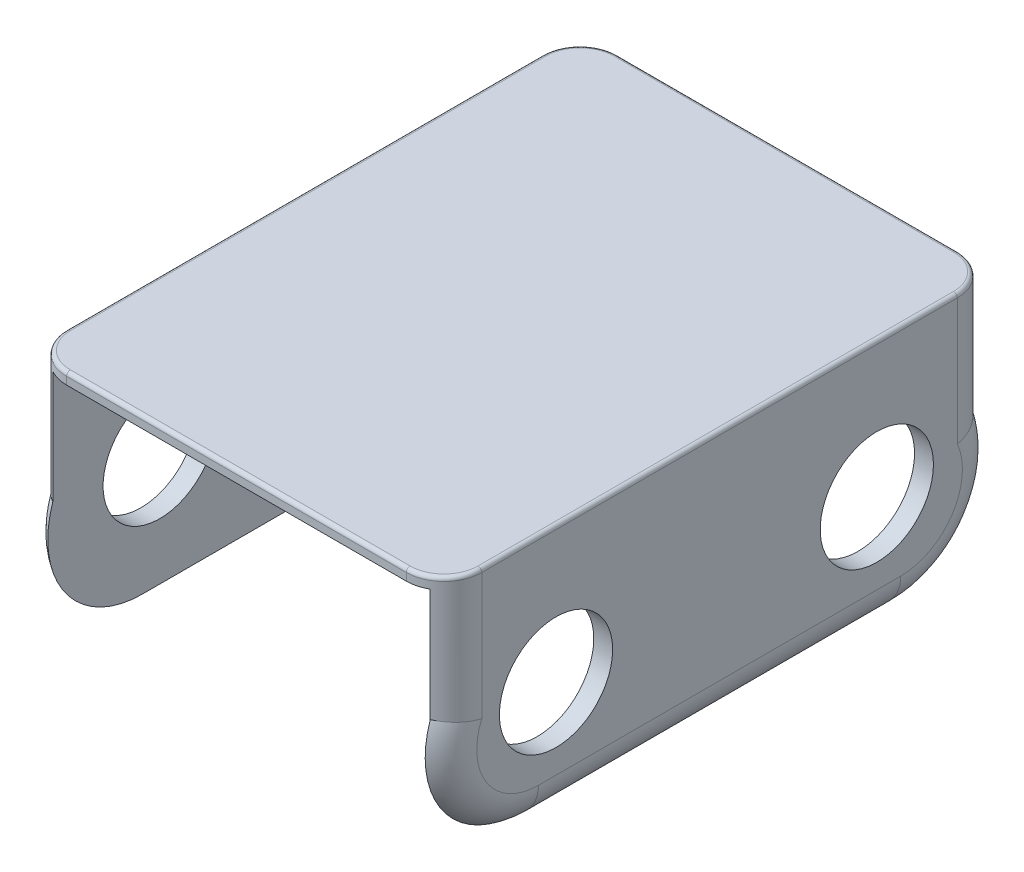
ISO-10303-21;
HEADER;
FILE_DESCRIPTION(('STEP AP214'),'2;1');
FILE_NAME('part.step','',(''),(''),'','','');
FILE_SCHEMA(('AUTOMOTIVE_DESIGN { 1 0 10303 214 1 1 1 1 }'));
ENDSEC;
DATA;
#1=APPLICATION_CONTEXT('core data for automotive mechanical design processes');
#2=APPLICATION_PROTOCOL_DEFINITION('international standard','automotive_design',2000,#1);
#3=PRODUCT_CONTEXT('',#1,'mechanical');
#4=PRODUCT('Part','Part','',(#3));
#5=PRODUCT_RELATED_PRODUCT_CATEGORY('part','',(#4));
#6=PRODUCT_DEFINITION_FORMATION('','',#4);
#7=PRODUCT_DEFINITION_CONTEXT('part definition',#1,'design');
#8=PRODUCT_DEFINITION('design','',#6,#7);
#9=PRODUCT_DEFINITION_SHAPE('','',#8);
#10=(LENGTH_UNIT() NAMED_UNIT(*) SI_UNIT(.MILLI.,.METRE.));
#11=(NAMED_UNIT(*) PLANE_ANGLE_UNIT() SI_UNIT($,.RADIAN.));
#12=(NAMED_UNIT(*) SI_UNIT($,.STERADIAN.) SOLID_ANGLE_UNIT());
#13=UNCERTAINTY_MEASURE_WITH_UNIT(LENGTH_MEASURE(1.E-05),#10,'distance_accuracy_value','');
#14=(GEOMETRIC_REPRESENTATION_CONTEXT(3) GLOBAL_UNCERTAINTY_ASSIGNED_CONTEXT((#13)) GLOBAL_UNIT_ASSIGNED_CONTEXT((#10,
#11,#12)) REPRESENTATION_CONTEXT('',''));
#15=CARTESIAN_POINT('',(0.,0.,0.));
#16=DIRECTION('',(0.,0.,1.));
#17=DIRECTION('',(1.,0.,0.));
#18=AXIS2_PLACEMENT_3D('',#15,#16,#17);
#19=CARTESIAN_POINT('',(0.,13.,0.));
#20=DIRECTION('',(0.,1.,0.));
#21=DIRECTION('',(0.,0.,1.));
#22=AXIS2_PLACEMENT_3D('',#19,#20,#21);
#23=PLANE('',#22);
#24=DIRECTION('',(0.,0.,1.));
#25=VECTOR('',#24,1.);
#26=CARTESIAN_POINT('',(-10.,13.,-15.));
#27=LINE('',#26,#25);
#28=CARTESIAN_POINT('',(-10.,13.,-14.3320508075689));
#29=VERTEX_POINT('',#28);
#30=CARTESIAN_POINT('',(-10.,13.,14.332050807569));
#31=VERTEX_POINT('',#30);
#32=EDGE_CURVE('E205',#29,#31,#27,.T.);
#33=ORIENTED_EDGE('',*,*,#32,.F.);
#34=CARTESIAN_POINT('',(-9.,13.,-12.6));
#35=DIRECTION('',(0.,1.,0.));
#36=DIRECTION('',(0.,0.,1.));
#37=AXIS2_PLACEMENT_3D('',#34,#35,#36);
#38=CIRCLE('',#37,2.);
#39=CARTESIAN_POINT('',(-9.,13.,-14.6));
#40=VERTEX_POINT('',#39);
#41=EDGE_CURVE('E241',#29,#40,#38,.F.);
#42=ORIENTED_EDGE('',*,*,#41,.T.);
#43=DIRECTION('',(-1.,0.,0.));
#44=VECTOR('',#43,1.);
#45=CARTESIAN_POINT('',(0.,13.,-14.6));
#46=LINE('',#45,#44);
#47=CARTESIAN_POINT('',(9.,13.,-14.6));
#48=VERTEX_POINT('',#47);
#49=EDGE_CURVE('E211',#48,#40,#46,.T.);
#50=ORIENTED_EDGE('',*,*,#49,.F.);
#51=CARTESIAN_POINT('',(9.,13.,-12.6));
#52=DIRECTION('',(0.,1.,0.));
#53=DIRECTION('',(0.,0.,1.));
#54=AXIS2_PLACEMENT_3D('',#51,#52,#53);
#55=CIRCLE('',#54,2.);
#56=CARTESIAN_POINT('',(10.,13.,-14.332050807569));
#57=VERTEX_POINT('',#56);
#58=EDGE_CURVE('E235',#48,#57,#55,.F.);
#59=ORIENTED_EDGE('',*,*,#58,.T.);
#60=DIRECTION('',(0.,0.,-1.));
#61=VECTOR('',#60,1.);
#62=CARTESIAN_POINT('',(10.,13.,-15.));
#63=LINE('',#62,#61);
#64=CARTESIAN_POINT('',(10.,13.,14.3320508075689));
#65=VERTEX_POINT('',#64);
#66=EDGE_CURVE('E200',#65,#57,#63,.T.);
#67=ORIENTED_EDGE('',*,*,#66,.F.);
#68=CARTESIAN_POINT('',(9.,13.,12.6));
#69=DIRECTION('',(0.,1.,0.));
#70=DIRECTION('',(0.,0.,1.));
#71=AXIS2_PLACEMENT_3D('',#68,#69,#70);
#72=CIRCLE('',#71,2.);
#73=CARTESIAN_POINT('',(9.,13.,14.6));
#74=VERTEX_POINT('',#73);
#75=EDGE_CURVE('E239',#65,#74,#72,.F.);
#76=ORIENTED_EDGE('',*,*,#75,.T.);
#77=DIRECTION('',(1.,0.,0.));
#78=VECTOR('',#77,1.);
#79=CARTESIAN_POINT('',(0.,13.,14.6));
#80=LINE('',#79,#78);
#81=CARTESIAN_POINT('',(-9.,13.,14.6));
#82=VERTEX_POINT('',#81);
#83=EDGE_CURVE('E208',#82,#74,#80,.T.);
#84=ORIENTED_EDGE('',*,*,#83,.F.);
#85=CARTESIAN_POINT('',(-9.,13.,12.6));
#86=DIRECTION('',(0.,1.,0.));
#87=DIRECTION('',(0.,0.,1.));
#88=AXIS2_PLACEMENT_3D('',#85,#86,#87);
#89=CIRCLE('',#88,2.);
#90=EDGE_CURVE('E237',#82,#31,#89,.F.);
#91=ORIENTED_EDGE('',*,*,#90,.T.);
#92=EDGE_LOOP('',(#33,#42,#50,#59,#67,#76,#84,#91));
#93=FACE_BOUND('',#92,.T.);
#94=ADVANCED_FACE('F34',(#93),#23,.F.);
#95=CARTESIAN_POINT('',(-10.,14.,-15.));
#96=DIRECTION('',(1.,0.,0.));
#97=DIRECTION('',(0.,0.,-1.));
#98=AXIS2_PLACEMENT_3D('',#95,#96,#97);
#99=PLANE('',#98);
#100=CARTESIAN_POINT('',(-10.,6.4,8.66794919243085));
#101=DIRECTION('',(1.,0.,0.));
#102=DIRECTION('',(0.,0.,-1.));
#103=AXIS2_PLACEMENT_3D('',#100,#101,#102);
#104=CIRCLE('',#103,3.);
#105=CARTESIAN_POINT('',(-10.,6.4,5.66794919243085));
#106=VERTEX_POINT('',#105);
#107=EDGE_CURVE('E486',#106,#106,#104,.T.);
#108=ORIENTED_EDGE('',*,*,#107,.F.);
#109=EDGE_LOOP('',(#108));
#110=FACE_BOUND('',#109,.T.);
#111=CARTESIAN_POINT('',(-10.,6.4,-8.33205080756915));
#112=DIRECTION('',(1.,0.,0.));
#113=DIRECTION('',(0.,0.,-1.));
#114=AXIS2_PLACEMENT_3D('',#111,#112,#113);
#115=CIRCLE('',#114,3.);
#116=CARTESIAN_POINT('',(-10.,6.4,-11.3320508075691));
#117=VERTEX_POINT('',#116);
#118=EDGE_CURVE('E363',#117,#117,#115,.T.);
#119=ORIENTED_EDGE('',*,*,#118,.F.);
#120=EDGE_LOOP('',(#119));
#121=FACE_BOUND('',#120,.T.);
#122=CARTESIAN_POINT('',(-10.,5.4,-9.6));
#123=DIRECTION('',(1.,0.,0.));
#124=DIRECTION('',(0.,0.,-1.));
#125=AXIS2_PLACEMENT_3D('',#122,#123,#124);
#126=CIRCLE('',#125,5.);
#127=CARTESIAN_POINT('',(-10.,0.4,-9.59999999999996));
#128=VERTEX_POINT('',#127);
#129=CARTESIAN_POINT('',(-10.,7.01483595284064,-14.3320508075689));
#130=VERTEX_POINT('',#129);
#131=EDGE_CURVE('E218',#128,#130,#126,.T.);
#132=ORIENTED_EDGE('',*,*,#131,.T.);
#133=DIRECTION('',(0.,1.,0.));
#134=VECTOR('',#133,1.);
#135=CARTESIAN_POINT('',(-10.,7.01483595284064,-14.3320508075689));
#136=LINE('',#135,#134);
#137=EDGE_CURVE('E233',#130,#29,#136,.T.);
#138=ORIENTED_EDGE('',*,*,#137,.T.);
#139=ORIENTED_EDGE('',*,*,#32,.T.);
#140=DIRECTION('',(0.,-1.,0.));
#141=VECTOR('',#140,1.);
#142=CARTESIAN_POINT('',(-10.,13.,14.3320508075689));
#143=LINE('',#142,#141);
#144=CARTESIAN_POINT('',(-10.,7.01483595283983,14.3320508075692));
#145=VERTEX_POINT('',#144);
#146=EDGE_CURVE('E230',#31,#145,#143,.T.);
#147=ORIENTED_EDGE('',*,*,#146,.T.);
#148=CARTESIAN_POINT('',(-10.,5.4,9.6));
#149=DIRECTION('',(1.,0.,0.));
#150=DIRECTION('',(0.,0.,-1.));
#151=AXIS2_PLACEMENT_3D('',#148,#149,#150);
#152=CIRCLE('',#151,5.);
#153=CARTESIAN_POINT('',(-10.,0.4,9.59999999999997));
#154=VERTEX_POINT('',#153);
#155=EDGE_CURVE('E214',#145,#154,#152,.T.);
#156=ORIENTED_EDGE('',*,*,#155,.T.);
#157=DIRECTION('',(0.,0.,-1.));
#158=VECTOR('',#157,1.);
#159=CARTESIAN_POINT('',(-10.,0.399999999999999,-15.));
#160=LINE('',#159,#158);
#161=EDGE_CURVE('E216',#154,#128,#160,.T.);
#162=ORIENTED_EDGE('',*,*,#161,.T.);
#163=EDGE_LOOP('',(#132,#138,#139,#147,#156,#162));
#164=FACE_BOUND('',#163,.T.);
#165=ADVANCED_FACE('F445',(#110,#121,#164),#99,.T.);
#166=CARTESIAN_POINT('',(10.,14.,-15.));
#167=DIRECTION('',(-1.,0.,0.));
#168=DIRECTION('',(0.,0.,1.));
#169=AXIS2_PLACEMENT_3D('',#166,#167,#168);
#170=PLANE('',#169);
#171=CARTESIAN_POINT('',(10.,6.4,8.66794919243085));
#172=DIRECTION('',(-1.,0.,0.));
#173=DIRECTION('',(0.,0.,1.));
#174=AXIS2_PLACEMENT_3D('',#171,#172,#173);
#175=CIRCLE('',#174,3.);
#176=CARTESIAN_POINT('',(10.,6.4,11.6679491924308));
#177=VERTEX_POINT('',#176);
#178=EDGE_CURVE('E492',#177,#177,#175,.T.);
#179=ORIENTED_EDGE('',*,*,#178,.F.);
#180=EDGE_LOOP('',(#179));
#181=FACE_BOUND('',#180,.T.);
#182=CARTESIAN_POINT('',(10.,6.4,-8.33205080756915));
#183=DIRECTION('',(-1.,0.,0.));
#184=DIRECTION('',(0.,0.,1.));
#185=AXIS2_PLACEMENT_3D('',#182,#183,#184);
#186=CIRCLE('',#185,3.);
#187=CARTESIAN_POINT('',(10.,6.4,-5.33205080756915));
#188=VERTEX_POINT('',#187);
#189=EDGE_CURVE('E489',#188,#188,#186,.T.);
#190=ORIENTED_EDGE('',*,*,#189,.F.);
#191=EDGE_LOOP('',(#190));
#192=FACE_BOUND('',#191,.T.);
#193=CARTESIAN_POINT('',(10.,5.4,9.6));
#194=DIRECTION('',(-1.,0.,0.));
#195=DIRECTION('',(0.,0.,1.));
#196=AXIS2_PLACEMENT_3D('',#193,#194,#195);
#197=CIRCLE('',#196,5.);
#198=CARTESIAN_POINT('',(10.,0.4,9.59999999999997));
#199=VERTEX_POINT('',#198);
#200=CARTESIAN_POINT('',(10.,7.01483595284064,14.3320508075689));
#201=VERTEX_POINT('',#200);
#202=EDGE_CURVE('E198',#199,#201,#197,.T.);
#203=ORIENTED_EDGE('',*,*,#202,.T.);
#204=DIRECTION('',(0.,-1.,0.));
#205=VECTOR('',#204,1.);
#206=CARTESIAN_POINT('',(10.,7.01483595284064,14.3320508075689));
#207=LINE('',#206,#205);
#208=EDGE_CURVE('E263',#201,#65,#207,.F.);
#209=ORIENTED_EDGE('',*,*,#208,.T.);
#210=ORIENTED_EDGE('',*,*,#66,.T.);
#211=DIRECTION('',(0.,1.,0.));
#212=VECTOR('',#211,1.);
#213=CARTESIAN_POINT('',(10.,13.,-14.3320508075689));
#214=LINE('',#213,#212);
#215=CARTESIAN_POINT('',(10.,7.01483595283983,-14.3320508075692));
#216=VERTEX_POINT('',#215);
#217=EDGE_CURVE('E179',#57,#216,#214,.F.);
#218=ORIENTED_EDGE('',*,*,#217,.T.);
#219=CARTESIAN_POINT('',(10.,5.4,-9.6));
#220=DIRECTION('',(-1.,0.,0.));
#221=DIRECTION('',(0.,0.,1.));
#222=AXIS2_PLACEMENT_3D('',#219,#220,#221);
#223=CIRCLE('',#222,5.);
#224=CARTESIAN_POINT('',(10.,0.4,-9.59999999999996));
#225=VERTEX_POINT('',#224);
#226=EDGE_CURVE('E171',#216,#225,#223,.T.);
#227=ORIENTED_EDGE('',*,*,#226,.T.);
#228=DIRECTION('',(0.,0.,1.));
#229=VECTOR('',#228,1.);
#230=CARTESIAN_POINT('',(10.,0.399999999999999,-15.));
#231=LINE('',#230,#229);
#232=EDGE_CURVE('E175',#225,#199,#231,.T.);
#233=ORIENTED_EDGE('',*,*,#232,.T.);
#234=EDGE_LOOP('',(#203,#209,#210,#218,#227,#233));
#235=FACE_BOUND('',#234,.T.);
#236=ADVANCED_FACE('F173',(#181,#192,#235),#170,.T.);
#237=CARTESIAN_POINT('',(11.,13.6,-14.6));
#238=DIRECTION('',(0.,0.,-1.));
#239=DIRECTION('',(-1.,0.,0.));
#240=AXIS2_PLACEMENT_3D('',#237,#238,#239);
#241=PLANE('',#240);
#242=DIRECTION('',(0.,-1.,0.));
#243=VECTOR('',#242,1.);
#244=CARTESIAN_POINT('',(-9.,13.6,-14.6));
#245=LINE('',#244,#243);
#246=CARTESIAN_POINT('',(-9.,13.4,-14.6));
#247=VERTEX_POINT('',#246);
#248=EDGE_CURVE('E245',#40,#247,#245,.F.);
#249=ORIENTED_EDGE('',*,*,#248,.T.);
#250=DIRECTION('',(-1.,0.,0.));
#251=VECTOR('',#250,1.);
#252=CARTESIAN_POINT('',(11.,13.4,-14.6));
#253=LINE('',#252,#251);
#254=CARTESIAN_POINT('',(9.,13.4,-14.6));
#255=VERTEX_POINT('',#254);
#256=EDGE_CURVE('E357',#247,#255,#253,.F.);
#257=ORIENTED_EDGE('',*,*,#256,.T.);
#258=DIRECTION('',(0.,-1.,0.));
#259=VECTOR('',#258,1.);
#260=CARTESIAN_POINT('',(9.,5.4,-14.6));
#261=LINE('',#260,#259);
#262=EDGE_CURVE('E243',#255,#48,#261,.T.);
#263=ORIENTED_EDGE('',*,*,#262,.T.);
#264=ORIENTED_EDGE('',*,*,#49,.T.);
#265=EDGE_LOOP('',(#249,#257,#263,#264));
#266=FACE_BOUND('',#265,.T.);
#267=ADVANCED_FACE('F449',(#266),#241,.T.);
#268=CARTESIAN_POINT('',(11.,13.6,14.6));
#269=DIRECTION('',(0.,1.,0.));
#270=DIRECTION('',(0.,0.,1.));
#271=AXIS2_PLACEMENT_3D('',#268,#269,#270);
#272=PLANE('',#271);
#273=DIRECTION('',(0.,0.,-1.));
#274=VECTOR('',#273,1.);
#275=CARTESIAN_POINT('',(-10.8,13.6,12.6));
#276=LINE('',#275,#274);
#277=CARTESIAN_POINT('',(-10.8,13.6,-12.6));
#278=VERTEX_POINT('',#277);
#279=CARTESIAN_POINT('',(-10.8,13.6,12.6));
#280=VERTEX_POINT('',#279);
#281=EDGE_CURVE('E265',#278,#280,#276,.F.);
#282=ORIENTED_EDGE('',*,*,#281,.T.);
#283=CARTESIAN_POINT('',(-9.,13.6,12.6));
#284=DIRECTION('',(0.,1.,0.));
#285=DIRECTION('',(0.,0.,1.));
#286=AXIS2_PLACEMENT_3D('',#283,#284,#285);
#287=CIRCLE('',#286,1.8);
#288=CARTESIAN_POINT('',(-9.,13.6,14.4));
#289=VERTEX_POINT('',#288);
#290=EDGE_CURVE('E343',#280,#289,#287,.T.);
#291=ORIENTED_EDGE('',*,*,#290,.T.);
#292=DIRECTION('',(-1.,0.,0.));
#293=VECTOR('',#292,1.);
#294=CARTESIAN_POINT('',(11.,13.6,14.4));
#295=LINE('',#294,#293);
#296=CARTESIAN_POINT('',(9.,13.6,14.4));
#297=VERTEX_POINT('',#296);
#298=EDGE_CURVE('E341',#289,#297,#295,.F.);
#299=ORIENTED_EDGE('',*,*,#298,.T.);
#300=CARTESIAN_POINT('',(9.,13.6,12.6));
#301=DIRECTION('',(0.,1.,0.));
#302=DIRECTION('',(0.,0.,1.));
#303=AXIS2_PLACEMENT_3D('',#300,#301,#302);
#304=CIRCLE('',#303,1.8);
#305=CARTESIAN_POINT('',(10.8,13.6,12.6));
#306=VERTEX_POINT('',#305);
#307=EDGE_CURVE('E339',#297,#306,#304,.T.);
#308=ORIENTED_EDGE('',*,*,#307,.T.);
#309=DIRECTION('',(0.,0.,-1.));
#310=VECTOR('',#309,1.);
#311=CARTESIAN_POINT('',(10.8,13.6,-12.6));
#312=LINE('',#311,#310);
#313=CARTESIAN_POINT('',(10.8,13.6,-12.6));
#314=VERTEX_POINT('',#313);
#315=EDGE_CURVE('E337',#306,#314,#312,.T.);
#316=ORIENTED_EDGE('',*,*,#315,.T.);
#317=CARTESIAN_POINT('',(9.,13.6,-12.6));
#318=DIRECTION('',(0.,1.,0.));
#319=DIRECTION('',(0.,0.,1.));
#320=AXIS2_PLACEMENT_3D('',#317,#318,#319);
#321=CIRCLE('',#320,1.8);
#322=CARTESIAN_POINT('',(9.,13.6,-14.4));
#323=VERTEX_POINT('',#322);
#324=EDGE_CURVE('E335',#314,#323,#321,.T.);
#325=ORIENTED_EDGE('',*,*,#324,.T.);
#326=DIRECTION('',(-1.,0.,0.));
#327=VECTOR('',#326,1.);
#328=CARTESIAN_POINT('',(11.,13.6,-14.4));
#329=LINE('',#328,#327);
#330=CARTESIAN_POINT('',(-9.,13.6,-14.4));
#331=VERTEX_POINT('',#330);
#332=EDGE_CURVE('E333',#323,#331,#329,.T.);
#333=ORIENTED_EDGE('',*,*,#332,.T.);
#334=CARTESIAN_POINT('',(-9.,13.6,-12.6));
#335=DIRECTION('',(0.,1.,0.));
#336=DIRECTION('',(0.,0.,1.));
#337=AXIS2_PLACEMENT_3D('',#334,#335,#336);
#338=CIRCLE('',#337,1.8);
#339=EDGE_CURVE('E331',#331,#278,#338,.T.);
#340=ORIENTED_EDGE('',*,*,#339,.T.);
#341=EDGE_LOOP('',(#282,#291,#299,#308,#316,#325,#333,#340));
#342=FACE_BOUND('',#341,.T.);
#343=ADVANCED_FACE('F451',(#342),#272,.T.);
#344=CARTESIAN_POINT('',(11.,5.40000000000004,14.6));
#345=DIRECTION('',(0.,0.,1.));
#346=DIRECTION('',(1.,0.,0.));
#347=AXIS2_PLACEMENT_3D('',#344,#345,#346);
#348=PLANE('',#347);
#349=DIRECTION('',(0.,1.,0.));
#350=VECTOR('',#349,1.);
#351=CARTESIAN_POINT('',(9.,13.6,14.6));
#352=LINE('',#351,#350);
#353=CARTESIAN_POINT('',(9.,13.4,14.6));
#354=VERTEX_POINT('',#353);
#355=EDGE_CURVE('E249',#74,#354,#352,.T.);
#356=ORIENTED_EDGE('',*,*,#355,.T.);
#357=DIRECTION('',(-1.,0.,0.));
#358=VECTOR('',#357,1.);
#359=CARTESIAN_POINT('',(11.,13.4,14.6));
#360=LINE('',#359,#358);
#361=CARTESIAN_POINT('',(-9.,13.4,14.6));
#362=VERTEX_POINT('',#361);
#363=EDGE_CURVE('E349',#354,#362,#360,.T.);
#364=ORIENTED_EDGE('',*,*,#363,.T.);
#365=DIRECTION('',(0.,1.,0.));
#366=VECTOR('',#365,1.);
#367=CARTESIAN_POINT('',(-9.,5.40000000000003,14.6));
#368=LINE('',#367,#366);
#369=EDGE_CURVE('E247',#362,#82,#368,.F.);
#370=ORIENTED_EDGE('',*,*,#369,.T.);
#371=ORIENTED_EDGE('',*,*,#83,.T.);
#372=EDGE_LOOP('',(#356,#364,#370,#371));
#373=FACE_BOUND('',#372,.T.);
#374=ADVANCED_FACE('F413',(#373),#348,.T.);
#375=CARTESIAN_POINT('',(-11.,14.,-15.));
#376=DIRECTION('',(1.,0.,0.));
#377=DIRECTION('',(0.,0.,-1.));
#378=AXIS2_PLACEMENT_3D('',#375,#376,#377);
#379=PLANE('',#378);
#380=CARTESIAN_POINT('',(-11.,6.4,8.66794919243085));
#381=DIRECTION('',(1.,0.,0.));
#382=DIRECTION('',(0.,0.,-1.));
#383=AXIS2_PLACEMENT_3D('',#380,#381,#382);
#384=CIRCLE('',#383,3.);
#385=CARTESIAN_POINT('',(-11.,6.4,5.66794919243085));
#386=VERTEX_POINT('',#385);
#387=EDGE_CURVE('E717',#386,#386,#384,.T.);
#388=ORIENTED_EDGE('',*,*,#387,.T.);
#389=EDGE_LOOP('',(#388));
#390=FACE_BOUND('',#389,.T.);
#391=CARTESIAN_POINT('',(-11.,6.4,-8.33205080756915));
#392=DIRECTION('',(1.,0.,0.));
#393=DIRECTION('',(0.,0.,-1.));
#394=AXIS2_PLACEMENT_3D('',#391,#392,#393);
#395=CIRCLE('',#394,3.);
#396=CARTESIAN_POINT('',(-11.,6.4,-11.3320508075691));
#397=VERTEX_POINT('',#396);
#398=EDGE_CURVE('E485',#397,#397,#395,.T.);
#399=ORIENTED_EDGE('',*,*,#398,.T.);
#400=EDGE_LOOP('',(#399));
#401=FACE_BOUND('',#400,.T.);
#402=DIRECTION('',(0.,1.,0.));
#403=VECTOR('',#402,1.);
#404=CARTESIAN_POINT('',(-11.,13.6,12.6));
#405=LINE('',#404,#403);
#406=CARTESIAN_POINT('',(-11.,6.69595213040884,12.6));
#407=VERTEX_POINT('',#406);
#408=CARTESIAN_POINT('',(-11.,13.4,12.6));
#409=VERTEX_POINT('',#408);
#410=EDGE_CURVE('E220',#407,#409,#405,.T.);
#411=ORIENTED_EDGE('',*,*,#410,.T.);
#412=DIRECTION('',(0.,0.,-1.));
#413=VECTOR('',#412,1.);
#414=CARTESIAN_POINT('',(-11.,13.4,-12.6));
#415=LINE('',#414,#413);
#416=CARTESIAN_POINT('',(-11.,13.4,-12.6));
#417=VERTEX_POINT('',#416);
#418=EDGE_CURVE('E12',#409,#417,#415,.T.);
#419=ORIENTED_EDGE('',*,*,#418,.T.);
#420=DIRECTION('',(0.,-1.,0.));
#421=VECTOR('',#420,1.);
#422=CARTESIAN_POINT('',(-11.,5.4,-12.6));
#423=LINE('',#422,#421);
#424=CARTESIAN_POINT('',(-11.,6.69595213040884,-12.6));
#425=VERTEX_POINT('',#424);
#426=EDGE_CURVE('E228',#417,#425,#423,.T.);
#427=ORIENTED_EDGE('',*,*,#426,.T.);
#428=CARTESIAN_POINT('',(-11.,5.4,-9.6));
#429=DIRECTION('',(1.,0.,0.));
#430=DIRECTION('',(0.,0.,-1.));
#431=AXIS2_PLACEMENT_3D('',#428,#429,#430);
#432=CIRCLE('',#431,3.26794919243112);
#433=CARTESIAN_POINT('',(-11.,2.13205080756888,-9.59999999999996));
#434=VERTEX_POINT('',#433);
#435=EDGE_CURVE('E226',#425,#434,#432,.F.);
#436=ORIENTED_EDGE('',*,*,#435,.T.);
#437=DIRECTION('',(0.,0.,1.));
#438=VECTOR('',#437,1.);
#439=CARTESIAN_POINT('',(-11.,2.13205080756888,-15.));
#440=LINE('',#439,#438);
#441=CARTESIAN_POINT('',(-11.,2.13205080756888,9.59999999999998));
#442=VERTEX_POINT('',#441);
#443=EDGE_CURVE('E224',#434,#442,#440,.T.);
#444=ORIENTED_EDGE('',*,*,#443,.T.);
#445=CARTESIAN_POINT('',(-11.,5.4,9.6));
#446=DIRECTION('',(1.,0.,0.));
#447=DIRECTION('',(0.,0.,-1.));
#448=AXIS2_PLACEMENT_3D('',#445,#446,#447);
#449=CIRCLE('',#448,3.26794919243112);
#450=EDGE_CURVE('E222',#442,#407,#449,.F.);
#451=ORIENTED_EDGE('',*,*,#450,.T.);
#452=EDGE_LOOP('',(#411,#419,#427,#436,#444,#451));
#453=FACE_BOUND('',#452,.T.);
#454=ADVANCED_FACE('F432',(#390,#401,#453),#379,.F.);
#455=CARTESIAN_POINT('',(11.,14.,-15.));
#456=DIRECTION('',(-1.,0.,0.));
#457=DIRECTION('',(0.,0.,1.));
#458=AXIS2_PLACEMENT_3D('',#455,#456,#457);
#459=PLANE('',#458);
#460=CARTESIAN_POINT('',(11.,6.4,8.66794919243085));
#461=DIRECTION('',(1.,0.,0.));
#462=DIRECTION('',(0.,0.,-1.));
#463=AXIS2_PLACEMENT_3D('',#460,#461,#462);
#464=CIRCLE('',#463,3.);
#465=CARTESIAN_POINT('',(11.,6.4,5.66794919243085));
#466=VERTEX_POINT('',#465);
#467=EDGE_CURVE('E480',#466,#466,#464,.T.);
#468=ORIENTED_EDGE('',*,*,#467,.F.);
#469=EDGE_LOOP('',(#468));
#470=FACE_BOUND('',#469,.T.);
#471=CARTESIAN_POINT('',(11.,6.4,-8.33205080756915));
#472=DIRECTION('',(1.,0.,0.));
#473=DIRECTION('',(0.,0.,-1.));
#474=AXIS2_PLACEMENT_3D('',#471,#472,#473);
#475=CIRCLE('',#474,3.);
#476=CARTESIAN_POINT('',(11.,6.4,-11.3320508075692));
#477=VERTEX_POINT('',#476);
#478=EDGE_CURVE('E483',#477,#477,#475,.T.);
#479=ORIENTED_EDGE('',*,*,#478,.F.);
#480=EDGE_LOOP('',(#479));
#481=FACE_BOUND('',#480,.T.);
#482=DIRECTION('',(0.,-1.,0.));
#483=VECTOR('',#482,1.);
#484=CARTESIAN_POINT('',(11.,13.6,-12.6));
#485=LINE('',#484,#483);
#486=CARTESIAN_POINT('',(11.,6.69595213040885,-12.6));
#487=VERTEX_POINT('',#486);
#488=CARTESIAN_POINT('',(11.,13.4,-12.6));
#489=VERTEX_POINT('',#488);
#490=EDGE_CURVE('E252',#487,#489,#485,.F.);
#491=ORIENTED_EDGE('',*,*,#490,.T.);
#492=DIRECTION('',(0.,0.,-1.));
#493=VECTOR('',#492,1.);
#494=CARTESIAN_POINT('',(11.,13.4,12.6));
#495=LINE('',#494,#493);
#496=CARTESIAN_POINT('',(11.,13.4,12.6));
#497=VERTEX_POINT('',#496);
#498=EDGE_CURVE('E353',#489,#497,#495,.F.);
#499=ORIENTED_EDGE('',*,*,#498,.T.);
#500=DIRECTION('',(0.,1.,0.));
#501=VECTOR('',#500,1.);
#502=CARTESIAN_POINT('',(11.,5.40000000000004,12.6));
#503=LINE('',#502,#501);
#504=CARTESIAN_POINT('',(11.,6.69595213040885,12.6));
#505=VERTEX_POINT('',#504);
#506=EDGE_CURVE('E260',#497,#505,#503,.F.);
#507=ORIENTED_EDGE('',*,*,#506,.T.);
#508=CARTESIAN_POINT('',(11.,5.4,9.6));
#509=DIRECTION('',(-1.,0.,0.));
#510=DIRECTION('',(0.,0.,1.));
#511=AXIS2_PLACEMENT_3D('',#508,#509,#510);
#512=CIRCLE('',#511,3.26794919243112);
#513=CARTESIAN_POINT('',(11.,2.13205080756888,9.59999999999997));
#514=VERTEX_POINT('',#513);
#515=EDGE_CURVE('E258',#505,#514,#512,.F.);
#516=ORIENTED_EDGE('',*,*,#515,.T.);
#517=DIRECTION('',(0.,0.,-1.));
#518=VECTOR('',#517,1.);
#519=CARTESIAN_POINT('',(11.,2.13205080756888,-15.));
#520=LINE('',#519,#518);
#521=CARTESIAN_POINT('',(11.,2.13205080756888,-9.59999999999997));
#522=VERTEX_POINT('',#521);
#523=EDGE_CURVE('E256',#514,#522,#520,.T.);
#524=ORIENTED_EDGE('',*,*,#523,.T.);
#525=CARTESIAN_POINT('',(11.,5.4,-9.6));
#526=DIRECTION('',(-1.,0.,0.));
#527=DIRECTION('',(0.,0.,1.));
#528=AXIS2_PLACEMENT_3D('',#525,#526,#527);
#529=CIRCLE('',#528,3.26794919243112);
#530=EDGE_CURVE('E189',#522,#487,#529,.F.);
#531=ORIENTED_EDGE('',*,*,#530,.T.);
#532=EDGE_LOOP('',(#491,#499,#507,#516,#524,#531));
#533=FACE_BOUND('',#532,.T.);
#534=ADVANCED_FACE('F397',(#470,#481,#533),#459,.F.);
#535=CARTESIAN_POINT('',(-9.,14.,12.6));
#536=DIRECTION('',(0.,-1.,0.));
#537=DIRECTION('',(0.,0.,-1.));
#538=AXIS2_PLACEMENT_3D('',#535,#536,#537);
#539=CYLINDRICAL_SURFACE('',#538,2.);
#540=ORIENTED_EDGE('',*,*,#369,.F.);
#541=CARTESIAN_POINT('',(-9.,13.4,12.6));
#542=DIRECTION('',(0.,1.,0.));
#543=DIRECTION('',(0.,0.,1.));
#544=AXIS2_PLACEMENT_3D('',#541,#542,#543);
#545=CIRCLE('',#544,2.);
#546=EDGE_CURVE('E346',#362,#409,#545,.F.);
#547=ORIENTED_EDGE('',*,*,#546,.T.);
#548=ORIENTED_EDGE('',*,*,#410,.F.);
#549=CARTESIAN_POINT('',(-11.,6.69595213040885,12.6));
#550=CARTESIAN_POINT('',(-11.0000000764707,6.69691067601748,12.6046360206856));
#551=CARTESIAN_POINT('',(-10.9999839513203,6.69786827106277,12.6092726325173));
#552=CARTESIAN_POINT('',(-10.9991617769945,6.72220204193962,12.7272262329139));
#553=CARTESIAN_POINT('',(-10.9886997075945,6.74500055934032,12.8408186582785));
#554=CARTESIAN_POINT('',(-10.9485187288496,6.78896386913943,13.0650929547573));
#555=CARTESIAN_POINT('',(-10.9187471672905,6.81012401699026,13.1757660042154));
#556=CARTESIAN_POINT('',(-10.8406054567103,6.85039283406634,13.3907140963521));
#557=CARTESIAN_POINT('',(-10.7922446963069,6.86950253266467,13.4949923379995));
#558=CARTESIAN_POINT('',(-10.6782039139399,6.90534792028562,13.6939738362865));
#559=CARTESIAN_POINT('',(-10.612533555888,6.92208492598437,13.7886823949725));
#560=CARTESIAN_POINT('',(-10.4638453053407,6.95331098815218,13.9678584085395));
#561=CARTESIAN_POINT('',(-10.3804410752658,6.96773476236009,14.0520173260183));
#562=CARTESIAN_POINT('',(-10.1998176661301,6.99358256603334,14.2044945466341));
#563=CARTESIAN_POINT('',(-10.1025989353917,7.00500669281207,14.2728133636411));
#564=CARTESIAN_POINT('',(-9.90390093437357,7.02404250747923,14.3875354282409));
#565=CARTESIAN_POINT('',(-9.80308176638472,7.03184987104604,14.4350528779059));
#566=CARTESIAN_POINT('',(-9.59479876731408,7.04455622898673,14.5127371395181));
#567=CARTESIAN_POINT('',(-9.48733584557254,7.04945562041019,14.5429063201511));
#568=CARTESIAN_POINT('',(-9.2687641935448,7.05627675529542,14.5849827735811));
#569=CARTESIAN_POINT('',(-9.15765429161807,7.05819753208494,14.5968841177669));
#570=CARTESIAN_POINT('',(-8.93500810782353,7.05903087026701,14.6020424481907));
#571=CARTESIAN_POINT('',(-8.8234718934104,7.0579438893727,14.5953022712495));
#572=CARTESIAN_POINT('',(-8.60345449963259,7.05278527777786,14.563433228165));
#573=CARTESIAN_POINT('',(-8.49496549223524,7.0487221957224,14.5383570313273));
#574=CARTESIAN_POINT('',(-8.28375416976099,7.03768019445563,14.4706420946198));
#575=CARTESIAN_POINT('',(-8.18103356785221,7.03070041415047,14.4279981682998));
#576=CARTESIAN_POINT('',(-7.98396899372588,7.01389742467131,14.3262646796184));
#577=CARTESIAN_POINT('',(-7.88964550187387,7.00406749967562,14.2671362875697));
#578=CARTESIAN_POINT('',(-7.75668032565742,6.98731691761191,14.1675584344127));
#579=CARTESIAN_POINT('',(-7.71375362982176,6.98139463087043,14.1325254398769));
#580=CARTESIAN_POINT('',(-7.63100217691246,6.96890000545538,14.0590758494342));
#581=CARTESIAN_POINT('',(-7.59117738245821,6.96232767461759,14.020659294314));
#582=CARTESIAN_POINT('',(-7.5530207093527,6.95543916513553,13.9806704648242));
#583=B_SPLINE_CURVE_WITH_KNOTS('',3,(#549,#550,#551,#552,#553,#554,#555,#556,#557,#558,#559,
#560,#561,#562,#563,#564,#565,#566,#567,#568,#569,#570,#571,#572,#573,#574,#575,#576,#577,#578,
#579,#580,#581,#582),.UNSPECIFIED.,.F.,.F.,(4,2,2,2,2,2,2,2,2,2,2,2,2,2,2,2,4),(0.,
0.014203346771423,0.361291613328093,0.709330305484478,1.05719344849933,1.40486279011328,
1.76106828300226,2.11726221858247,2.4508904795417,2.78447317697962,3.11816411188475,
3.45180426932118,3.78448980811899,4.11727363479677,4.45084806563623,4.61785126829634,
4.78485245811035),.UNSPECIFIED.);
#584=EDGE_CURVE('E183',#145,#407,#583,.F.);
#585=ORIENTED_EDGE('',*,*,#584,.F.);
#586=ORIENTED_EDGE('',*,*,#146,.F.);
#587=ORIENTED_EDGE('',*,*,#90,.F.);
#588=EDGE_LOOP('',(#540,#547,#548,#585,#586,#587));
#589=FACE_BOUND('',#588,.T.);
#590=ADVANCED_FACE('F292',(#589),#539,.T.);
#591=CARTESIAN_POINT('',(-9.,5.4,9.6));
#592=DIRECTION('',(-1.,0.,0.));
#593=DIRECTION('',(0.,0.,1.));
#594=AXIS2_PLACEMENT_3D('',#591,#592,#593);
#595=TOROIDAL_SURFACE('',#594,3.26794919243112,2.);
#596=ORIENTED_EDGE('',*,*,#584,.T.);
#597=ORIENTED_EDGE('',*,*,#450,.F.);
#598=CARTESIAN_POINT('',(-9.,2.13205080756897,9.59999999999998));
#599=DIRECTION('',(0.,0.,-1.));
#600=DIRECTION('',(0.,1.,0.));
#601=AXIS2_PLACEMENT_3D('',#598,#599,#600);
#602=CIRCLE('',#601,2.);
#603=EDGE_CURVE('E302',#154,#442,#602,.T.);
#604=ORIENTED_EDGE('',*,*,#603,.F.);
#605=ORIENTED_EDGE('',*,*,#155,.F.);
#606=EDGE_LOOP('',(#596,#597,#604,#605));
#607=FACE_BOUND('',#606,.T.);
#608=ADVANCED_FACE('F287',(#607),#595,.T.);
#609=CARTESIAN_POINT('',(-9.,2.13205080756888,-9.59999999999996));
#610=DIRECTION('',(0.,0.,1.));
#611=DIRECTION('',(1.,0.,0.));
#612=AXIS2_PLACEMENT_3D('',#609,#610,#611);
#613=CYLINDRICAL_SURFACE('',#612,2.);
#614=ORIENTED_EDGE('',*,*,#603,.T.);
#615=ORIENTED_EDGE('',*,*,#443,.F.);
#616=CARTESIAN_POINT('',(-9.,2.13205080756897,-9.59999999999996));
#617=DIRECTION('',(0.,0.,-1.));
#618=DIRECTION('',(-1.,0.,0.));
#619=AXIS2_PLACEMENT_3D('',#616,#617,#618);
#620=CIRCLE('',#619,2.);
#621=EDGE_CURVE('E274',#128,#434,#620,.T.);
#622=ORIENTED_EDGE('',*,*,#621,.F.);
#623=ORIENTED_EDGE('',*,*,#161,.F.);
#624=EDGE_LOOP('',(#614,#615,#622,#623));
#625=FACE_BOUND('',#624,.T.);
#626=ADVANCED_FACE('F283',(#625),#613,.T.);
#627=CARTESIAN_POINT('',(-9.,5.4,-9.6));
#628=DIRECTION('',(-1.,0.,0.));
#629=DIRECTION('',(0.,0.,1.));
#630=AXIS2_PLACEMENT_3D('',#627,#628,#629);
#631=TOROIDAL_SURFACE('',#630,3.26794919243112,2.);
#632=ORIENTED_EDGE('',*,*,#621,.T.);
#633=ORIENTED_EDGE('',*,*,#435,.F.);
#634=CARTESIAN_POINT('',(-11.,6.69595213040884,-12.6));
#635=CARTESIAN_POINT('',(-11.0000000764707,6.6969106760175,-12.6046360206856));
#636=CARTESIAN_POINT('',(-10.9999839513203,6.6978682710628,-12.6092726325172));
#637=CARTESIAN_POINT('',(-10.9991617769945,6.72220204194003,-12.7272262329139));
#638=CARTESIAN_POINT('',(-10.9886997075945,6.74500055934044,-12.8408186582786));
#639=CARTESIAN_POINT('',(-10.9485187288496,6.78896386913936,-13.0650929547576));
#640=CARTESIAN_POINT('',(-10.9187471672904,6.81012401699028,-13.1757660042157));
#641=CARTESIAN_POINT('',(-10.8406054567102,6.85039283406644,-13.3907140963525));
#642=CARTESIAN_POINT('',(-10.7922446963067,6.86950253266475,-13.4949923379999));
#643=CARTESIAN_POINT('',(-10.6782039139396,6.90534792028569,-13.693973836287));
#644=CARTESIAN_POINT('',(-10.6125335558877,6.92208492598446,-13.7886823949729));
#645=CARTESIAN_POINT('',(-10.4638453053403,6.95331098815224,-13.9678584085399));
#646=CARTESIAN_POINT('',(-10.3804410752655,6.96773476236014,-14.0520173260186));
#647=CARTESIAN_POINT('',(-10.19981766613,6.99358256603335,-14.2044945466342));
#648=CARTESIAN_POINT('',(-10.1025989353917,7.00500669281207,-14.2728133636411));
#649=CARTESIAN_POINT('',(-9.90390093437366,7.02404250747922,-14.3875354282408));
#650=CARTESIAN_POINT('',(-9.80308176638481,7.03184987104603,-14.4350528779058));
#651=CARTESIAN_POINT('',(-9.59479876731417,7.04455622898672,-14.5127371395181));
#652=CARTESIAN_POINT('',(-9.48733584557263,7.04945562041019,-14.542906320151));
#653=CARTESIAN_POINT('',(-9.26876419354489,7.05627675529542,-14.5849827735811));
#654=CARTESIAN_POINT('',(-9.15765429161816,7.05819753208493,-14.5968841177668));
#655=CARTESIAN_POINT('',(-8.93500810782363,7.059030870267,-14.6020424481907));
#656=CARTESIAN_POINT('',(-8.8234718934105,7.0579438893727,-14.5953022712495));
#657=CARTESIAN_POINT('',(-8.60345449963268,7.05278527777786,-14.563433228165));
#658=CARTESIAN_POINT('',(-8.49496549223533,7.04872219572241,-14.5383570313273));
#659=CARTESIAN_POINT('',(-8.28375416976107,7.03768019445563,-14.4706420946198));
#660=CARTESIAN_POINT('',(-8.18103356785229,7.03070041415047,-14.4279981682999));
#661=CARTESIAN_POINT('',(-7.98396899372596,7.01389742467132,-14.3262646796184));
#662=CARTESIAN_POINT('',(-7.88964550187394,7.00406749967562,-14.2671362875698));
#663=CARTESIAN_POINT('',(-7.7566803256575,6.98731691761192,-14.1675584344127));
#664=CARTESIAN_POINT('',(-7.71375362982183,6.98139463087043,-14.1325254398769));
#665=CARTESIAN_POINT('',(-7.63100217691253,6.96890000545539,-14.0590758494342));
#666=CARTESIAN_POINT('',(-7.59117738245828,6.96232767461761,-14.0206592943141));
#667=CARTESIAN_POINT('',(-7.55302070935276,6.95543916513554,-13.9806704648242));
#668=B_SPLINE_CURVE_WITH_KNOTS('',3,(#634,#635,#636,#637,#638,#639,#640,#641,#642,#643,#644,
#645,#646,#647,#648,#649,#650,#651,#652,#653,#654,#655,#656,#657,#658,#659,#660,#661,#662,#663,
#664,#665,#666,#667),.UNSPECIFIED.,.F.,.F.,(4,2,2,2,2,2,2,2,2,2,2,2,2,2,2,2,4),(0.,
0.0142033467714222,0.361291613328243,0.709330305484793,1.05719344849982,1.40486279011394,
1.76106828300254,2.11726221858236,2.45089047954161,2.78447317697954,3.11816411188466,
3.45180426932109,3.78448980811891,4.11727363479668,4.45084806563615,4.61785126829626,
4.78485245811026),.UNSPECIFIED.);
#669=EDGE_CURVE('E266',#130,#425,#668,.F.);
#670=ORIENTED_EDGE('',*,*,#669,.F.);
#671=ORIENTED_EDGE('',*,*,#131,.F.);
#672=EDGE_LOOP('',(#632,#633,#670,#671));
#673=FACE_BOUND('',#672,.T.);
#674=ADVANCED_FACE('F279',(#673),#631,.T.);
#675=CARTESIAN_POINT('',(-9.,14.,-12.6));
#676=DIRECTION('',(0.,1.,0.));
#677=DIRECTION('',(0.,0.,1.));
#678=AXIS2_PLACEMENT_3D('',#675,#676,#677);
#679=CYLINDRICAL_SURFACE('',#678,2.);
#680=ORIENTED_EDGE('',*,*,#426,.F.);
#681=CARTESIAN_POINT('',(-9.,13.4,-12.6));
#682=DIRECTION('',(0.,1.,0.));
#683=DIRECTION('',(0.,0.,1.));
#684=AXIS2_PLACEMENT_3D('',#681,#682,#683);
#685=CIRCLE('',#684,2.);
#686=EDGE_CURVE('E43',#417,#247,#685,.F.);
#687=ORIENTED_EDGE('',*,*,#686,.T.);
#688=ORIENTED_EDGE('',*,*,#248,.F.);
#689=ORIENTED_EDGE('',*,*,#41,.F.);
#690=ORIENTED_EDGE('',*,*,#137,.F.);
#691=ORIENTED_EDGE('',*,*,#669,.T.);
#692=EDGE_LOOP('',(#680,#687,#688,#689,#690,#691));
#693=FACE_BOUND('',#692,.T.);
#694=ADVANCED_FACE('F276',(#693),#679,.T.);
#695=CARTESIAN_POINT('',(9.,13.6,-12.6));
#696=DIRECTION('',(0.,1.,0.));
#697=DIRECTION('',(0.,0.,1.));
#698=AXIS2_PLACEMENT_3D('',#695,#696,#697);
#699=CYLINDRICAL_SURFACE('',#698,2.);
#700=ORIENTED_EDGE('',*,*,#262,.F.);
#701=CARTESIAN_POINT('',(9.,13.4,-12.6));
#702=DIRECTION('',(0.,1.,0.));
#703=DIRECTION('',(0.,0.,1.));
#704=AXIS2_PLACEMENT_3D('',#701,#702,#703);
#705=CIRCLE('',#704,2.);
#706=EDGE_CURVE('E355',#255,#489,#705,.F.);
#707=ORIENTED_EDGE('',*,*,#706,.T.);
#708=ORIENTED_EDGE('',*,*,#490,.F.);
#709=CARTESIAN_POINT('',(11.,6.69595213040885,-12.6));
#710=CARTESIAN_POINT('',(11.0000000764707,6.69691067601743,-12.6046360206856));
#711=CARTESIAN_POINT('',(10.9999839513203,6.69786827106267,-12.6092726325173));
#712=CARTESIAN_POINT('',(10.9991617769945,6.72220204193839,-12.727226232914));
#713=CARTESIAN_POINT('',(10.9886997075945,6.74500055933993,-12.8408186582783));
#714=CARTESIAN_POINT('',(10.9485187288497,6.78896386913964,-13.0650929547567));
#715=CARTESIAN_POINT('',(10.9187471672907,6.81012401699021,-13.1757660042147));
#716=CARTESIAN_POINT('',(10.8406054567107,6.85039283406607,-13.3907140963512));
#717=CARTESIAN_POINT('',(10.7922446963075,6.86950253266444,-13.4949923379984));
#718=CARTESIAN_POINT('',(10.6782039139408,6.9053479202854,-13.6939738362852));
#719=CARTESIAN_POINT('',(10.6125335558891,6.92208492598413,-13.7886823949711));
#720=CARTESIAN_POINT('',(10.4638453053418,6.95331098815198,-13.9678584085383));
#721=CARTESIAN_POINT('',(10.3804410752667,6.96773476235994,-14.0520173260174));
#722=CARTESIAN_POINT('',(10.1998176661306,6.99358256603327,-14.2044945466337));
#723=CARTESIAN_POINT('',(10.1025989353919,7.00500669281204,-14.2728133636409));
#724=CARTESIAN_POINT('',(9.90390093437357,7.02404250747923,-14.3875354282409));
#725=CARTESIAN_POINT('',(9.80308176638471,7.03184987104604,-14.4350528779058));
#726=CARTESIAN_POINT('',(9.59479876731407,7.04455622898673,-14.5127371395181));
#727=CARTESIAN_POINT('',(9.48733584557253,7.04945562041019,-14.542906320151));
#728=CARTESIAN_POINT('',(9.2687641935448,7.05627675529542,-14.5849827735811));
#729=CARTESIAN_POINT('',(9.15765429161807,7.05819753208493,-14.5968841177668));
#730=CARTESIAN_POINT('',(8.93500810782353,7.059030870267,-14.6020424481907));
#731=CARTESIAN_POINT('',(8.8234718934104,7.0579438893727,-14.5953022712495));
#732=CARTESIAN_POINT('',(8.60345449963259,7.05278527777786,-14.563433228165));
#733=CARTESIAN_POINT('',(8.49496549223524,7.04872219572241,-14.5383570313273));
#734=CARTESIAN_POINT('',(8.28375416976098,7.03768019445563,-14.4706420946198));
#735=CARTESIAN_POINT('',(8.1810335678522,7.03070041415047,-14.4279981682998));
#736=CARTESIAN_POINT('',(7.98396899372588,7.01389742467131,-14.3262646796184));
#737=CARTESIAN_POINT('',(7.88964550187386,7.00406749967561,-14.2671362875697));
#738=CARTESIAN_POINT('',(7.75668032565742,6.98731691761191,-14.1675584344127));
#739=CARTESIAN_POINT('',(7.71375362982175,6.98139463087043,-14.1325254398769));
#740=CARTESIAN_POINT('',(7.63100217691246,6.96890000545539,-14.0590758494342));
#741=CARTESIAN_POINT('',(7.59117738245821,6.9623276746176,-14.020659294314));
#742=CARTESIAN_POINT('',(7.55302070935269,6.95543916513553,-13.9806704648242));
#743=B_SPLINE_CURVE_WITH_KNOTS('',3,(#709,#710,#711,#712,#713,#714,#715,#716,#717,#718,#719,
#720,#721,#722,#723,#724,#725,#726,#727,#728,#729,#730,#731,#732,#733,#734,#735,#736,#737,#738,
#739,#740,#741,#742),.UNSPECIFIED.,.F.,.F.,(4,2,2,2,2,2,2,2,2,2,2,2,2,2,2,2,4),(0.,
0.0142033467714183,0.36129161332764,0.70933030548356,1.05719344849791,1.40486279011137,
1.76106828300131,2.11726221858247,2.45089047954171,2.78447317697962,3.11816411188475,
3.45180426932118,3.784489808119,4.11727363479677,4.45084806563624,4.61785126829635,
4.78485245811035),.UNSPECIFIED.);
#744=EDGE_CURVE('E192',#216,#487,#743,.F.);
#745=ORIENTED_EDGE('',*,*,#744,.F.);
#746=ORIENTED_EDGE('',*,*,#217,.F.);
#747=ORIENTED_EDGE('',*,*,#58,.F.);
#748=EDGE_LOOP('',(#700,#707,#708,#745,#746,#747));
#749=FACE_BOUND('',#748,.T.);
#750=ADVANCED_FACE('F322',(#749),#699,.T.);
#751=CARTESIAN_POINT('',(9.,5.4,-9.6));
#752=DIRECTION('',(1.,0.,0.));
#753=DIRECTION('',(0.,0.,-1.));
#754=AXIS2_PLACEMENT_3D('',#751,#752,#753);
#755=TOROIDAL_SURFACE('',#754,3.26794919243112,2.);
#756=ORIENTED_EDGE('',*,*,#744,.T.);
#757=ORIENTED_EDGE('',*,*,#530,.F.);
#758=CARTESIAN_POINT('',(9.,2.13205080756897,-9.59999999999997));
#759=DIRECTION('',(0.,0.,1.));
#760=DIRECTION('',(0.,-1.,0.));
#761=AXIS2_PLACEMENT_3D('',#758,#759,#760);
#762=CIRCLE('',#761,2.);
#763=EDGE_CURVE('E187',#225,#522,#762,.T.);
#764=ORIENTED_EDGE('',*,*,#763,.F.);
#765=ORIENTED_EDGE('',*,*,#226,.F.);
#766=EDGE_LOOP('',(#756,#757,#764,#765));
#767=FACE_BOUND('',#766,.T.);
#768=ADVANCED_FACE('F188',(#767),#755,.T.);
#769=CARTESIAN_POINT('',(9.,2.13205080756888,-9.59999999999996));
#770=DIRECTION('',(0.,0.,-1.));
#771=DIRECTION('',(-1.,0.,0.));
#772=AXIS2_PLACEMENT_3D('',#769,#770,#771);
#773=CYLINDRICAL_SURFACE('',#772,2.);
#774=ORIENTED_EDGE('',*,*,#763,.T.);
#775=ORIENTED_EDGE('',*,*,#523,.F.);
#776=CARTESIAN_POINT('',(9.,2.13205080756897,9.59999999999997));
#777=DIRECTION('',(0.,0.,1.));
#778=DIRECTION('',(1.,0.,0.));
#779=AXIS2_PLACEMENT_3D('',#776,#777,#778);
#780=CIRCLE('',#779,2.);
#781=EDGE_CURVE('E193',#199,#514,#780,.T.);
#782=ORIENTED_EDGE('',*,*,#781,.F.);
#783=ORIENTED_EDGE('',*,*,#232,.F.);
#784=EDGE_LOOP('',(#774,#775,#782,#783));
#785=FACE_BOUND('',#784,.T.);
#786=ADVANCED_FACE('F195',(#785),#773,.T.);
#787=CARTESIAN_POINT('',(9.,5.4,9.6));
#788=DIRECTION('',(1.,0.,0.));
#789=DIRECTION('',(0.,0.,-1.));
#790=AXIS2_PLACEMENT_3D('',#787,#788,#789);
#791=TOROIDAL_SURFACE('',#790,3.26794919243112,2.);
#792=ORIENTED_EDGE('',*,*,#781,.T.);
#793=ORIENTED_EDGE('',*,*,#515,.F.);
#794=CARTESIAN_POINT('',(11.,6.69595213040885,12.6));
#795=CARTESIAN_POINT('',(11.0000000764707,6.69691067601736,12.6046360206856));
#796=CARTESIAN_POINT('',(10.9999839513203,6.69786827106253,12.6092726325173));
#797=CARTESIAN_POINT('',(10.9991617769945,6.72220204193654,12.7272262329142));
#798=CARTESIAN_POINT('',(10.9886997075946,6.74500055933934,12.8408186582779));
#799=CARTESIAN_POINT('',(10.9485187288499,6.78896386913993,13.0650929547557));
#800=CARTESIAN_POINT('',(10.918747167291,6.81012401699012,13.1757660042136));
#801=CARTESIAN_POINT('',(10.8406054567114,6.85039283406567,13.3907140963497));
#802=CARTESIAN_POINT('',(10.7922446963083,6.86950253266409,13.4949923379968));
#803=CARTESIAN_POINT('',(10.6782039139421,6.90534792028508,13.6939738362832));
#804=CARTESIAN_POINT('',(10.6125335558906,6.92208492598377,13.7886823949689));
#805=CARTESIAN_POINT('',(10.4638453053435,6.95331098815166,13.9678584085366));
#806=CARTESIAN_POINT('',(10.3804410752682,6.96773476235971,14.0520173260161));
#807=CARTESIAN_POINT('',(10.1998176661314,6.99358256603318,14.2044945466331));
#808=CARTESIAN_POINT('',(10.1025989353924,7.005006692812,14.2728133636406));
#809=CARTESIAN_POINT('',(9.90390093437367,7.02404250747922,14.3875354282408));
#810=CARTESIAN_POINT('',(9.80308176638481,7.03184987104603,14.4350528779058));
#811=CARTESIAN_POINT('',(9.59479876731417,7.04455622898673,14.5127371395181));
#812=CARTESIAN_POINT('',(9.48733584557263,7.04945562041019,14.542906320151));
#813=CARTESIAN_POINT('',(9.26876419354489,7.05627675529542,14.5849827735811));
#814=CARTESIAN_POINT('',(9.15765429161816,7.05819753208493,14.5968841177668));
#815=CARTESIAN_POINT('',(8.93500810782363,7.05903087026701,14.6020424481907));
#816=CARTESIAN_POINT('',(8.8234718934105,7.0579438893727,14.5953022712496));
#817=CARTESIAN_POINT('',(8.60345449963268,7.05278527777786,14.5634332281651));
#818=CARTESIAN_POINT('',(8.49496549223533,7.04872219572241,14.5383570313273));
#819=CARTESIAN_POINT('',(8.28375416976107,7.03768019445563,14.4706420946198));
#820=CARTESIAN_POINT('',(8.18103356785229,7.03070041415047,14.4279981682999));
#821=CARTESIAN_POINT('',(7.98396899372596,7.01389742467132,14.3262646796184));
#822=CARTESIAN_POINT('',(7.88964550187395,7.00406749967563,14.2671362875698));
#823=CARTESIAN_POINT('',(7.7566803256575,6.98731691761192,14.1675584344127));
#824=CARTESIAN_POINT('',(7.71375362982183,6.98139463087044,14.1325254398769));
#825=CARTESIAN_POINT('',(7.63100217691253,6.96890000545539,14.0590758494342));
#826=CARTESIAN_POINT('',(7.59117738245828,6.96232767461761,14.0206592943141));
#827=CARTESIAN_POINT('',(7.55302070935276,6.95543916513555,13.9806704648243));
#828=B_SPLINE_CURVE_WITH_KNOTS('',3,(#794,#795,#796,#797,#798,#799,#800,#801,#802,#803,#804,
#805,#806,#807,#808,#809,#810,#811,#812,#813,#814,#815,#816,#817,#818,#819,#820,#821,#822,#823,
#824,#825,#826,#827),.UNSPECIFIED.,.F.,.F.,(4,2,2,2,2,2,2,2,2,2,2,2,2,2,2,2,4),(0.,
0.0142033467714253,0.361291613326974,0.709330305482177,1.05719344849576,1.40486279010849,
1.76106828299981,2.11726221858235,2.45089047954161,2.78447317697954,3.11816411188466,
3.45180426932109,3.7844898081189,4.11727363479667,4.45084806563614,4.61785126829625,
4.78485245811025),.UNSPECIFIED.);
#829=EDGE_CURVE('E303',#201,#505,#828,.F.);
#830=ORIENTED_EDGE('',*,*,#829,.F.);
#831=ORIENTED_EDGE('',*,*,#202,.F.);
#832=EDGE_LOOP('',(#792,#793,#830,#831));
#833=FACE_BOUND('',#832,.T.);
#834=ADVANCED_FACE('F312',(#833),#791,.T.);
#835=CARTESIAN_POINT('',(9.,5.40000000000004,12.6));
#836=DIRECTION('',(0.,-1.,0.));
#837=DIRECTION('',(0.,0.,-1.));
#838=AXIS2_PLACEMENT_3D('',#835,#836,#837);
#839=CYLINDRICAL_SURFACE('',#838,2.);
#840=ORIENTED_EDGE('',*,*,#506,.F.);
#841=CARTESIAN_POINT('',(9.,13.4,12.6));
#842=DIRECTION('',(0.,1.,0.));
#843=DIRECTION('',(0.,0.,1.));
#844=AXIS2_PLACEMENT_3D('',#841,#842,#843);
#845=CIRCLE('',#844,2.);
#846=EDGE_CURVE('E351',#497,#354,#845,.F.);
#847=ORIENTED_EDGE('',*,*,#846,.T.);
#848=ORIENTED_EDGE('',*,*,#355,.F.);
#849=ORIENTED_EDGE('',*,*,#75,.F.);
#850=ORIENTED_EDGE('',*,*,#208,.F.);
#851=ORIENTED_EDGE('',*,*,#829,.T.);
#852=EDGE_LOOP('',(#840,#847,#848,#849,#850,#851));
#853=FACE_BOUND('',#852,.T.);
#854=ADVANCED_FACE('F310',(#853),#839,.T.);
#855=CARTESIAN_POINT('',(9.,13.4,-12.6));
#856=DIRECTION('',(0.,1.,0.));
#857=DIRECTION('',(0.,0.,1.));
#858=AXIS2_PLACEMENT_3D('',#855,#856,#857);
#859=TOROIDAL_SURFACE('',#858,1.8,0.2);
#860=CARTESIAN_POINT('',(10.8,13.4,-12.6));
#861=DIRECTION('',(0.,0.,1.));
#862=DIRECTION('',(1.,0.,0.));
#863=AXIS2_PLACEMENT_3D('',#860,#861,#862);
#864=CIRCLE('',#863,0.2);
#865=EDGE_CURVE('E376',#489,#314,#864,.T.);
#866=ORIENTED_EDGE('',*,*,#865,.F.);
#867=ORIENTED_EDGE('',*,*,#706,.F.);
#868=CARTESIAN_POINT('',(9.,13.4,-14.4));
#869=DIRECTION('',(-1.,0.,0.));
#870=DIRECTION('',(0.,0.,1.));
#871=AXIS2_PLACEMENT_3D('',#868,#869,#870);
#872=CIRCLE('',#871,0.2);
#873=EDGE_CURVE('E38',#323,#255,#872,.T.);
#874=ORIENTED_EDGE('',*,*,#873,.F.);
#875=ORIENTED_EDGE('',*,*,#324,.F.);
#876=EDGE_LOOP('',(#866,#867,#874,#875));
#877=FACE_BOUND('',#876,.T.);
#878=ADVANCED_FACE('F36',(#877),#859,.T.);
#879=CARTESIAN_POINT('',(11.,13.4,-14.4));
#880=DIRECTION('',(-1.,0.,0.));
#881=DIRECTION('',(0.,0.,1.));
#882=AXIS2_PLACEMENT_3D('',#879,#880,#881);
#883=CYLINDRICAL_SURFACE('',#882,0.2);
#884=ORIENTED_EDGE('',*,*,#873,.T.);
#885=ORIENTED_EDGE('',*,*,#256,.F.);
#886=CARTESIAN_POINT('',(-9.,13.4,-14.4));
#887=DIRECTION('',(-1.,0.,0.));
#888=DIRECTION('',(0.,0.,1.));
#889=AXIS2_PLACEMENT_3D('',#886,#887,#888);
#890=CIRCLE('',#889,0.2);
#891=EDGE_CURVE('E374',#331,#247,#890,.T.);
#892=ORIENTED_EDGE('',*,*,#891,.F.);
#893=ORIENTED_EDGE('',*,*,#332,.F.);
#894=EDGE_LOOP('',(#884,#885,#892,#893));
#895=FACE_BOUND('',#894,.T.);
#896=ADVANCED_FACE('F387',(#895),#883,.T.);
#897=CARTESIAN_POINT('',(10.8,13.4,14.6));
#898=DIRECTION('',(0.,0.,1.));
#899=DIRECTION('',(1.,0.,0.));
#900=AXIS2_PLACEMENT_3D('',#897,#898,#899);
#901=CYLINDRICAL_SURFACE('',#900,0.2);
#902=ORIENTED_EDGE('',*,*,#865,.T.);
#903=ORIENTED_EDGE('',*,*,#315,.F.);
#904=CARTESIAN_POINT('',(10.8,13.4,12.6));
#905=DIRECTION('',(0.,0.,1.));
#906=DIRECTION('',(1.,0.,0.));
#907=AXIS2_PLACEMENT_3D('',#904,#905,#906);
#908=CIRCLE('',#907,0.2);
#909=EDGE_CURVE('E371',#497,#306,#908,.T.);
#910=ORIENTED_EDGE('',*,*,#909,.F.);
#911=ORIENTED_EDGE('',*,*,#498,.F.);
#912=EDGE_LOOP('',(#902,#903,#910,#911));
#913=FACE_BOUND('',#912,.T.);
#914=ADVANCED_FACE('F534',(#913),#901,.T.);
#915=CARTESIAN_POINT('',(-9.,13.4,-12.6));
#916=DIRECTION('',(0.,1.,0.));
#917=DIRECTION('',(0.,0.,1.));
#918=AXIS2_PLACEMENT_3D('',#915,#916,#917);
#919=TOROIDAL_SURFACE('',#918,1.8,0.2);
#920=ORIENTED_EDGE('',*,*,#891,.T.);
#921=ORIENTED_EDGE('',*,*,#686,.F.);
#922=CARTESIAN_POINT('',(-10.8,13.4,-12.6));
#923=DIRECTION('',(0.,0.,1.));
#924=DIRECTION('',(1.,0.,0.));
#925=AXIS2_PLACEMENT_3D('',#922,#923,#924);
#926=CIRCLE('',#925,0.2);
#927=EDGE_CURVE('E368',#278,#417,#926,.T.);
#928=ORIENTED_EDGE('',*,*,#927,.F.);
#929=ORIENTED_EDGE('',*,*,#339,.F.);
#930=EDGE_LOOP('',(#920,#921,#928,#929));
#931=FACE_BOUND('',#930,.T.);
#932=ADVANCED_FACE('F531',(#931),#919,.T.);
#933=CARTESIAN_POINT('',(9.,13.4,12.6));
#934=DIRECTION('',(0.,1.,0.));
#935=DIRECTION('',(0.,0.,1.));
#936=AXIS2_PLACEMENT_3D('',#933,#934,#935);
#937=TOROIDAL_SURFACE('',#936,1.8,0.2);
#938=ORIENTED_EDGE('',*,*,#909,.T.);
#939=ORIENTED_EDGE('',*,*,#307,.F.);
#940=CARTESIAN_POINT('',(9.,13.4,14.4));
#941=DIRECTION('',(-1.,0.,0.));
#942=DIRECTION('',(0.,0.,1.));
#943=AXIS2_PLACEMENT_3D('',#940,#941,#942);
#944=CIRCLE('',#943,0.2);
#945=EDGE_CURVE('E365',#354,#297,#944,.T.);
#946=ORIENTED_EDGE('',*,*,#945,.F.);
#947=ORIENTED_EDGE('',*,*,#846,.F.);
#948=EDGE_LOOP('',(#938,#939,#946,#947));
#949=FACE_BOUND('',#948,.T.);
#950=ADVANCED_FACE('F418',(#949),#937,.T.);
#951=CARTESIAN_POINT('',(-10.8,13.4,-15.));
#952=DIRECTION('',(0.,0.,1.));
#953=DIRECTION('',(1.,0.,0.));
#954=AXIS2_PLACEMENT_3D('',#951,#952,#953);
#955=CYLINDRICAL_SURFACE('',#954,0.2);
#956=ORIENTED_EDGE('',*,*,#927,.T.);
#957=ORIENTED_EDGE('',*,*,#418,.F.);
#958=CARTESIAN_POINT('',(-10.8,13.4,12.6));
#959=DIRECTION('',(0.,0.,1.));
#960=DIRECTION('',(1.,0.,0.));
#961=AXIS2_PLACEMENT_3D('',#958,#959,#960);
#962=CIRCLE('',#961,0.2);
#963=EDGE_CURVE('E362',#280,#409,#962,.T.);
#964=ORIENTED_EDGE('',*,*,#963,.F.);
#965=ORIENTED_EDGE('',*,*,#281,.F.);
#966=EDGE_LOOP('',(#956,#957,#964,#965));
#967=FACE_BOUND('',#966,.T.);
#968=ADVANCED_FACE('F523',(#967),#955,.T.);
#969=CARTESIAN_POINT('',(11.,13.4,14.4));
#970=DIRECTION('',(-1.,0.,0.));
#971=DIRECTION('',(0.,0.,1.));
#972=AXIS2_PLACEMENT_3D('',#969,#970,#971);
#973=CYLINDRICAL_SURFACE('',#972,0.2);
#974=ORIENTED_EDGE('',*,*,#945,.T.);
#975=ORIENTED_EDGE('',*,*,#298,.F.);
#976=CARTESIAN_POINT('',(-9.,13.4,14.4));
#977=DIRECTION('',(-1.,0.,0.));
#978=DIRECTION('',(0.,0.,1.));
#979=AXIS2_PLACEMENT_3D('',#976,#977,#978);
#980=CIRCLE('',#979,0.2);
#981=EDGE_CURVE('E360',#362,#289,#980,.T.);
#982=ORIENTED_EDGE('',*,*,#981,.F.);
#983=ORIENTED_EDGE('',*,*,#363,.F.);
#984=EDGE_LOOP('',(#974,#975,#982,#983));
#985=FACE_BOUND('',#984,.T.);
#986=ADVANCED_FACE('F422',(#985),#973,.T.);
#987=CARTESIAN_POINT('',(-9.,13.4,12.6));
#988=DIRECTION('',(0.,1.,0.));
#989=DIRECTION('',(0.,0.,1.));
#990=AXIS2_PLACEMENT_3D('',#987,#988,#989);
#991=TOROIDAL_SURFACE('',#990,1.8,0.2);
#992=ORIENTED_EDGE('',*,*,#963,.T.);
#993=ORIENTED_EDGE('',*,*,#546,.F.);
#994=ORIENTED_EDGE('',*,*,#981,.T.);
#995=ORIENTED_EDGE('',*,*,#290,.F.);
#996=EDGE_LOOP('',(#992,#993,#994,#995));
#997=FACE_BOUND('',#996,.T.);
#998=ADVANCED_FACE('F426',(#997),#991,.T.);
#999=CARTESIAN_POINT('',(-11.,6.4,-8.33205080756915));
#1000=DIRECTION('',(1.,0.,0.));
#1001=DIRECTION('',(0.,0.,-1.));
#1002=AXIS2_PLACEMENT_3D('',#999,#1000,#1001);
#1003=CYLINDRICAL_SURFACE('',#1002,3.);
#1004=ORIENTED_EDGE('',*,*,#189,.T.);
#1005=EDGE_LOOP('',(#1004));
#1006=FACE_BOUND('',#1005,.T.);
#1007=ORIENTED_EDGE('',*,*,#478,.T.);
#1008=EDGE_LOOP('',(#1007));
#1009=FACE_BOUND('',#1008,.T.);
#1010=ADVANCED_FACE('F504',(#1006,#1009),#1003,.F.);
#1011=ORIENTED_EDGE('',*,*,#118,.T.);
#1012=EDGE_LOOP('',(#1011));
#1013=FACE_BOUND('',#1012,.T.);
#1014=ORIENTED_EDGE('',*,*,#398,.F.);
#1015=EDGE_LOOP('',(#1014));
#1016=FACE_BOUND('',#1015,.T.);
#1017=ADVANCED_FACE('F499',(#1013,#1016),#1003,.F.);
#1018=CARTESIAN_POINT('',(-11.,6.4,8.66794919243085));
#1019=DIRECTION('',(1.,0.,0.));
#1020=DIRECTION('',(0.,0.,-1.));
#1021=AXIS2_PLACEMENT_3D('',#1018,#1019,#1020);
#1022=CYLINDRICAL_SURFACE('',#1021,3.);
#1023=ORIENTED_EDGE('',*,*,#178,.T.);
#1024=EDGE_LOOP('',(#1023));
#1025=FACE_BOUND('',#1024,.T.);
#1026=ORIENTED_EDGE('',*,*,#467,.T.);
#1027=EDGE_LOOP('',(#1026));
#1028=FACE_BOUND('',#1027,.T.);
#1029=ADVANCED_FACE('F503',(#1025,#1028),#1022,.F.);
#1030=ORIENTED_EDGE('',*,*,#107,.T.);
#1031=EDGE_LOOP('',(#1030));
#1032=FACE_BOUND('',#1031,.T.);
#1033=ORIENTED_EDGE('',*,*,#387,.F.);
#1034=EDGE_LOOP('',(#1033));
#1035=FACE_BOUND('',#1034,.T.);
#1036=ADVANCED_FACE('F511',(#1032,#1035),#1022,.F.);
#1037=CLOSED_SHELL('',(#94,#165,#236,#267,#343,#374,#454,#534,#590,#608,#626,#674,#694,#750,
#768,#786,#834,#854,#878,#896,#914,#932,#950,#968,#986,#998,#1010,#1017,#1029,#1036));
#1038=MANIFOLD_SOLID_BREP('B2',#1037);
#1039=ADVANCED_BREP_SHAPE_REPRESENTATION('',(#18,#1038),#14);
#1040=SHAPE_DEFINITION_REPRESENTATION(#9,#1039);
ENDSEC;
END-ISO-10303-21;
